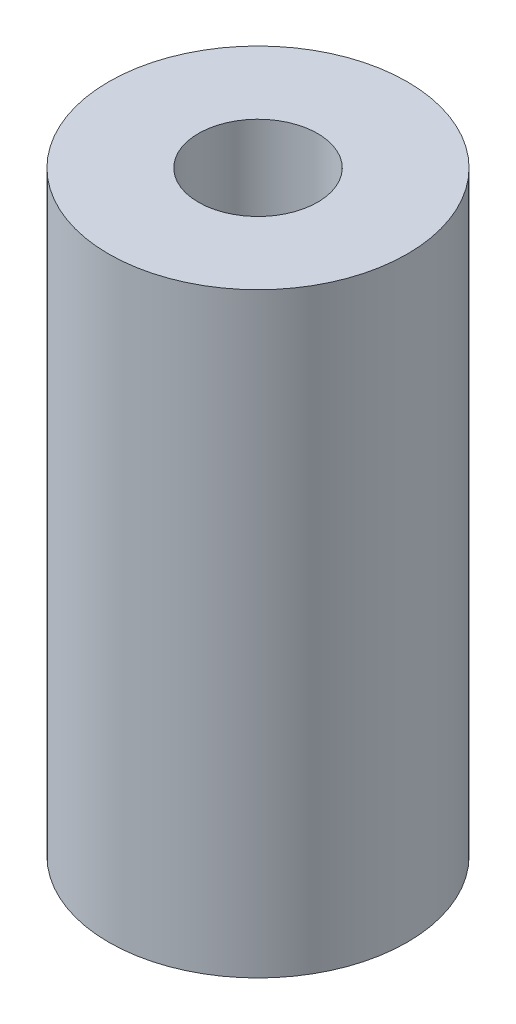
ISO-10303-21;
HEADER;
FILE_DESCRIPTION(('STEP AP214'),'2;1');
FILE_NAME('part.step','',(''),(''),'','','');
FILE_SCHEMA(('AUTOMOTIVE_DESIGN { 1 0 10303 214 1 1 1 1 }'));
ENDSEC;
DATA;
#1=APPLICATION_CONTEXT('core data for automotive mechanical design processes');
#2=APPLICATION_PROTOCOL_DEFINITION('international standard','automotive_design',2000,#1);
#3=PRODUCT_CONTEXT('',#1,'mechanical');
#4=PRODUCT('Part','Part','',(#3));
#5=PRODUCT_RELATED_PRODUCT_CATEGORY('part','',(#4));
#6=PRODUCT_DEFINITION_FORMATION('','',#4);
#7=PRODUCT_DEFINITION_CONTEXT('part definition',#1,'design');
#8=PRODUCT_DEFINITION('design','',#6,#7);
#9=PRODUCT_DEFINITION_SHAPE('','',#8);
#10=(LENGTH_UNIT() NAMED_UNIT(*) SI_UNIT(.MILLI.,.METRE.));
#11=(NAMED_UNIT(*) PLANE_ANGLE_UNIT() SI_UNIT($,.RADIAN.));
#12=(NAMED_UNIT(*) SI_UNIT($,.STERADIAN.) SOLID_ANGLE_UNIT());
#13=UNCERTAINTY_MEASURE_WITH_UNIT(LENGTH_MEASURE(1.E-05),#10,'distance_accuracy_value','');
#14=(GEOMETRIC_REPRESENTATION_CONTEXT(3) GLOBAL_UNCERTAINTY_ASSIGNED_CONTEXT((#13)) GLOBAL_UNIT_ASSIGNED_CONTEXT((#10,
#11,#12)) REPRESENTATION_CONTEXT('',''));
#15=CARTESIAN_POINT('',(0.,0.,0.));
#16=DIRECTION('',(0.,0.,1.));
#17=DIRECTION('',(1.,0.,0.));
#18=AXIS2_PLACEMENT_3D('',#15,#16,#17);
#19=CARTESIAN_POINT('',(0.,63.5,0.));
#20=DIRECTION('',(0.,-1.,0.));
#21=DIRECTION('',(0.,0.,-1.));
#22=AXIS2_PLACEMENT_3D('',#19,#20,#21);
#23=CYLINDRICAL_SURFACE('',#22,15.9004);
#24=CARTESIAN_POINT('',(0.,63.5,0.));
#25=DIRECTION('',(0.,1.,0.));
#26=DIRECTION('',(0.,0.,1.));
#27=AXIS2_PLACEMENT_3D('',#24,#25,#26);
#28=CIRCLE('',#27,15.9004);
#29=CARTESIAN_POINT('',(0.,63.5,15.9004));
#30=VERTEX_POINT('',#29);
#31=EDGE_CURVE('E10',#30,#30,#28,.T.);
#32=ORIENTED_EDGE('',*,*,#31,.F.);
#33=EDGE_LOOP('',(#32));
#34=FACE_BOUND('',#33,.T.);
#35=CARTESIAN_POINT('',(0.,0.,0.));
#36=DIRECTION('',(0.,1.,0.));
#37=DIRECTION('',(0.,0.,1.));
#38=AXIS2_PLACEMENT_3D('',#35,#36,#37);
#39=CIRCLE('',#38,15.9004);
#40=CARTESIAN_POINT('',(0.,0.,15.9004));
#41=VERTEX_POINT('',#40);
#42=EDGE_CURVE('E40',#41,#41,#39,.T.);
#43=ORIENTED_EDGE('',*,*,#42,.T.);
#44=EDGE_LOOP('',(#43));
#45=FACE_BOUND('',#44,.T.);
#46=ADVANCED_FACE('F37',(#34,#45),#23,.T.);
#47=CARTESIAN_POINT('',(0.,63.5,0.));
#48=DIRECTION('',(0.,1.,0.));
#49=DIRECTION('',(0.,0.,1.));
#50=AXIS2_PLACEMENT_3D('',#47,#48,#49);
#51=PLANE('',#50);
#52=CARTESIAN_POINT('',(0.,63.5,0.));
#53=DIRECTION('',(0.,1.,0.));
#54=DIRECTION('',(0.,0.,1.));
#55=AXIS2_PLACEMENT_3D('',#52,#53,#54);
#56=CIRCLE('',#55,6.35);
#57=CARTESIAN_POINT('',(0.,63.5,6.35));
#58=VERTEX_POINT('',#57);
#59=EDGE_CURVE('E51',#58,#58,#56,.T.);
#60=ORIENTED_EDGE('',*,*,#59,.F.);
#61=EDGE_LOOP('',(#60));
#62=FACE_BOUND('',#61,.T.);
#63=ORIENTED_EDGE('',*,*,#31,.T.);
#64=EDGE_LOOP('',(#63));
#65=FACE_BOUND('',#64,.T.);
#66=ADVANCED_FACE('F68',(#62,#65),#51,.T.);
#67=CARTESIAN_POINT('',(0.,0.,0.));
#68=DIRECTION('',(0.,1.,0.));
#69=DIRECTION('',(0.,0.,1.));
#70=AXIS2_PLACEMENT_3D('',#67,#68,#69);
#71=PLANE('',#70);
#72=CARTESIAN_POINT('',(0.,0.,0.));
#73=DIRECTION('',(0.,1.,0.));
#74=DIRECTION('',(0.,0.,1.));
#75=AXIS2_PLACEMENT_3D('',#72,#73,#74);
#76=CIRCLE('',#75,6.35);
#77=CARTESIAN_POINT('',(0.,0.,6.35));
#78=VERTEX_POINT('',#77);
#79=EDGE_CURVE('E49',#78,#78,#76,.T.);
#80=ORIENTED_EDGE('',*,*,#79,.T.);
#81=EDGE_LOOP('',(#80));
#82=FACE_BOUND('',#81,.T.);
#83=ORIENTED_EDGE('',*,*,#42,.F.);
#84=EDGE_LOOP('',(#83));
#85=FACE_BOUND('',#84,.T.);
#86=ADVANCED_FACE('F59',(#82,#85),#71,.F.);
#87=CARTESIAN_POINT('',(0.,0.,0.));
#88=DIRECTION('',(0.,1.,0.));
#89=DIRECTION('',(0.,0.,1.));
#90=AXIS2_PLACEMENT_3D('',#87,#88,#89);
#91=CYLINDRICAL_SURFACE('',#90,6.35);
#92=ORIENTED_EDGE('',*,*,#79,.F.);
#93=EDGE_LOOP('',(#92));
#94=FACE_BOUND('',#93,.T.);
#95=ORIENTED_EDGE('',*,*,#59,.T.);
#96=EDGE_LOOP('',(#95));
#97=FACE_BOUND('',#96,.T.);
#98=ADVANCED_FACE('F62',(#94,#97),#91,.F.);
#99=CLOSED_SHELL('',(#46,#66,#86,#98));
#100=MANIFOLD_SOLID_BREP('B2',#99);
#101=ADVANCED_BREP_SHAPE_REPRESENTATION('',(#18,#100),#14);
#102=SHAPE_DEFINITION_REPRESENTATION(#9,#101);
ENDSEC;
END-ISO-10303-21;
